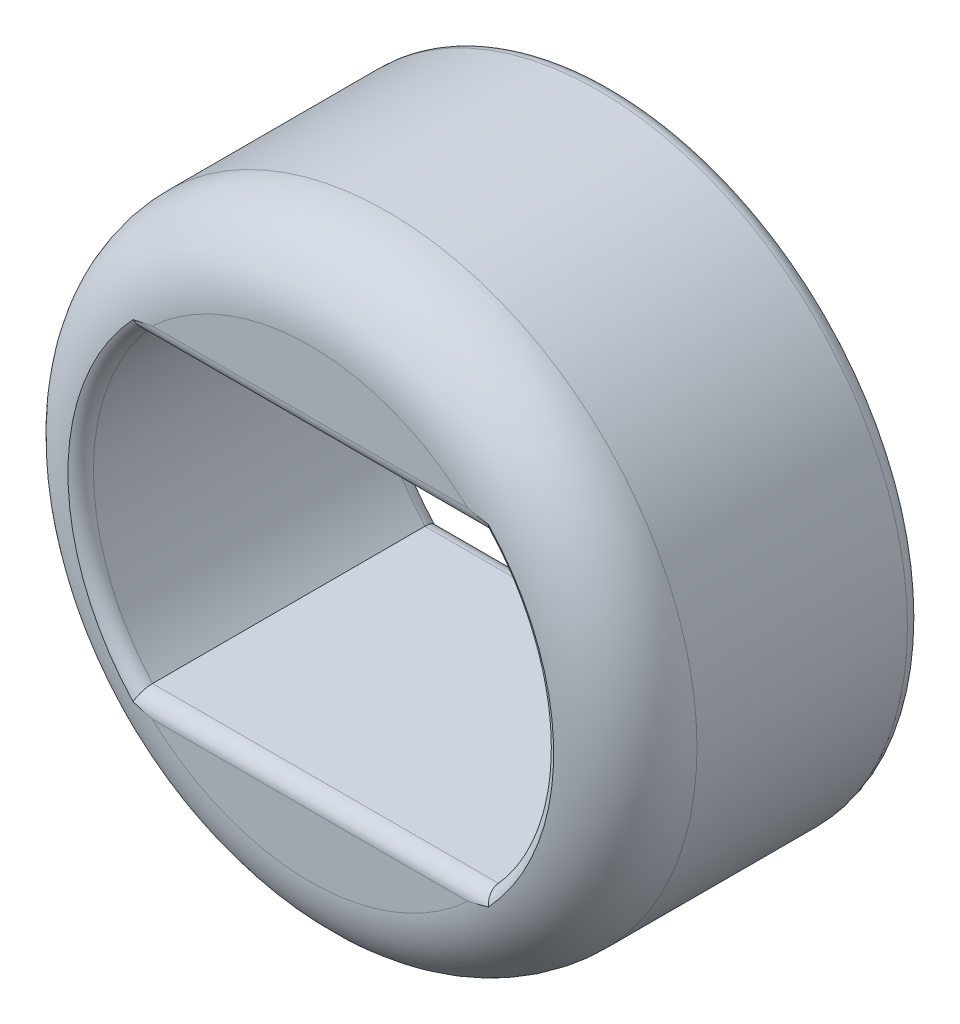
ISO-10303-21;
HEADER;
FILE_DESCRIPTION(('STEP AP214'),'2;1');
FILE_NAME('part.step','',(''),(''),'','','');
FILE_SCHEMA(('AUTOMOTIVE_DESIGN { 1 0 10303 214 1 1 1 1 }'));
ENDSEC;
DATA;
#1=APPLICATION_CONTEXT('core data for automotive mechanical design processes');
#2=APPLICATION_PROTOCOL_DEFINITION('international standard','automotive_design',2000,#1);
#3=PRODUCT_CONTEXT('',#1,'mechanical');
#4=PRODUCT('Part','Part','',(#3));
#5=PRODUCT_RELATED_PRODUCT_CATEGORY('part','',(#4));
#6=PRODUCT_DEFINITION_FORMATION('','',#4);
#7=PRODUCT_DEFINITION_CONTEXT('part definition',#1,'design');
#8=PRODUCT_DEFINITION('design','',#6,#7);
#9=PRODUCT_DEFINITION_SHAPE('','',#8);
#10=(LENGTH_UNIT() NAMED_UNIT(*) SI_UNIT(.MILLI.,.METRE.));
#11=(NAMED_UNIT(*) PLANE_ANGLE_UNIT() SI_UNIT($,.RADIAN.));
#12=(NAMED_UNIT(*) SI_UNIT($,.STERADIAN.) SOLID_ANGLE_UNIT());
#13=UNCERTAINTY_MEASURE_WITH_UNIT(LENGTH_MEASURE(1.E-05),#10,'distance_accuracy_value','');
#14=(GEOMETRIC_REPRESENTATION_CONTEXT(3) GLOBAL_UNCERTAINTY_ASSIGNED_CONTEXT((#13)) GLOBAL_UNIT_ASSIGNED_CONTEXT((#10,
#11,#12)) REPRESENTATION_CONTEXT('',''));
#15=CARTESIAN_POINT('',(0.,0.,0.));
#16=DIRECTION('',(0.,0.,1.));
#17=DIRECTION('',(1.,0.,0.));
#18=AXIS2_PLACEMENT_3D('',#15,#16,#17);
#19=CARTESIAN_POINT('',(0.,-10.,-30.));
#20=DIRECTION('',(0.,0.,-1.));
#21=DIRECTION('',(-1.,0.,0.));
#22=AXIS2_PLACEMENT_3D('',#19,#20,#21);
#23=PLANE('',#22);
#24=DIRECTION('',(1.,0.,0.));
#25=VECTOR('',#24,1.);
#26=CARTESIAN_POINT('',(5.59016994374947,5.5,-30.));
#27=LINE('',#26,#25);
#28=CARTESIAN_POINT('',(-5.09901951359279,5.5,-30.));
#29=VERTEX_POINT('',#28);
#30=CARTESIAN_POINT('',(5.09901951359279,5.5,-30.));
#31=VERTEX_POINT('',#30);
#32=EDGE_CURVE('E208',#29,#31,#27,.T.);
#33=ORIENTED_EDGE('',*,*,#32,.T.);
#34=CARTESIAN_POINT('',(0.,0.,-30.));
#35=DIRECTION('',(0.,0.,-1.));
#36=DIRECTION('',(-1.,0.,0.));
#37=AXIS2_PLACEMENT_3D('',#34,#35,#36);
#38=CIRCLE('',#37,7.5);
#39=EDGE_CURVE('E268',#31,#29,#38,.F.);
#40=ORIENTED_EDGE('',*,*,#39,.T.);
#41=EDGE_LOOP('',(#33,#40));
#42=FACE_BOUND('',#41,.T.);
#43=ADVANCED_FACE('F37',(#42),#23,.F.);
#44=CARTESIAN_POINT('',(0.,0.,-39.8));
#45=DIRECTION('',(0.,0.,1.));
#46=DIRECTION('',(1.,0.,0.));
#47=AXIS2_PLACEMENT_3D('',#44,#45,#46);
#48=CYLINDRICAL_SURFACE('',#47,10.);
#49=CARTESIAN_POINT('',(0.,0.,-32.5));
#50=DIRECTION('',(0.,0.,-1.));
#51=DIRECTION('',(-1.,0.,0.));
#52=AXIS2_PLACEMENT_3D('',#49,#50,#51);
#53=CIRCLE('',#52,10.);
#54=CARTESIAN_POINT('',(10.,0.,-32.5));
#55=VERTEX_POINT('',#54);
#56=EDGE_CURVE('E11',#55,#55,#53,.T.);
#57=CARTESIAN_POINT('',(0.,0.,-39.3));
#58=DIRECTION('',(0.,0.,1.));
#59=DIRECTION('',(1.,0.,0.));
#60=AXIS2_PLACEMENT_3D('',#57,#58,#59);
#61=CIRCLE('',#60,10.);
#62=CARTESIAN_POINT('',(10.,0.,-39.3));
#63=VERTEX_POINT('',#62);
#64=EDGE_CURVE('E308',#63,#63,#61,.T.);
#65=CARTESIAN_POINT('',(10.,0.,-32.5));
#66=CARTESIAN_POINT('',(10.,0.,-32.5708333333333));
#67=CARTESIAN_POINT('',(10.,0.,-32.6416666666667));
#68=CARTESIAN_POINT('',(10.,0.,-32.7833333333333));
#69=CARTESIAN_POINT('',(10.,0.,-32.8541666666667));
#70=CARTESIAN_POINT('',(10.,0.,-32.9958333333333));
#71=CARTESIAN_POINT('',(10.,0.,-33.0666666666667));
#72=CARTESIAN_POINT('',(10.,0.,-33.2083333333333));
#73=CARTESIAN_POINT('',(10.,0.,-33.2791666666667));
#74=CARTESIAN_POINT('',(10.,0.,-33.4208333333333));
#75=CARTESIAN_POINT('',(10.,0.,-33.4916666666667));
#76=CARTESIAN_POINT('',(10.,0.,-33.6333333333333));
#77=CARTESIAN_POINT('',(10.,0.,-33.7041666666667));
#78=CARTESIAN_POINT('',(10.,0.,-33.8458333333333));
#79=CARTESIAN_POINT('',(10.,0.,-33.9166666666667));
#80=CARTESIAN_POINT('',(10.,0.,-34.0583333333333));
#81=CARTESIAN_POINT('',(10.,0.,-34.1291666666667));
#82=CARTESIAN_POINT('',(10.,0.,-34.2708333333333));
#83=CARTESIAN_POINT('',(10.,0.,-34.3416666666667));
#84=CARTESIAN_POINT('',(10.,0.,-34.4833333333333));
#85=CARTESIAN_POINT('',(10.,0.,-34.5541666666667));
#86=CARTESIAN_POINT('',(10.,0.,-34.6958333333333));
#87=CARTESIAN_POINT('',(10.,0.,-34.7666666666667));
#88=CARTESIAN_POINT('',(10.,0.,-34.9083333333333));
#89=CARTESIAN_POINT('',(10.,0.,-34.9791666666667));
#90=CARTESIAN_POINT('',(10.,0.,-35.1208333333333));
#91=CARTESIAN_POINT('',(10.,0.,-35.1916666666667));
#92=CARTESIAN_POINT('',(10.,0.,-35.3333333333333));
#93=CARTESIAN_POINT('',(10.,0.,-35.4041666666667));
#94=CARTESIAN_POINT('',(10.,0.,-35.5458333333333));
#95=CARTESIAN_POINT('',(10.,0.,-35.6166666666667));
#96=CARTESIAN_POINT('',(10.,0.,-35.7583333333333));
#97=CARTESIAN_POINT('',(10.,0.,-35.8291666666667));
#98=CARTESIAN_POINT('',(10.,0.,-35.9708333333333));
#99=CARTESIAN_POINT('',(10.,0.,-36.0416666666667));
#100=CARTESIAN_POINT('',(10.,0.,-36.1833333333333));
#101=CARTESIAN_POINT('',(10.,0.,-36.2541666666667));
#102=CARTESIAN_POINT('',(10.,0.,-36.3958333333333));
#103=CARTESIAN_POINT('',(10.,0.,-36.4666666666667));
#104=CARTESIAN_POINT('',(10.,0.,-36.6083333333333));
#105=CARTESIAN_POINT('',(10.,0.,-36.6791666666667));
#106=CARTESIAN_POINT('',(10.,0.,-36.8208333333333));
#107=CARTESIAN_POINT('',(10.,0.,-36.8916666666667));
#108=CARTESIAN_POINT('',(10.,0.,-37.0333333333333));
#109=CARTESIAN_POINT('',(10.,0.,-37.1041666666667));
#110=CARTESIAN_POINT('',(10.,0.,-37.2458333333333));
#111=CARTESIAN_POINT('',(10.,0.,-37.3166666666667));
#112=CARTESIAN_POINT('',(10.,0.,-37.4583333333333));
#113=CARTESIAN_POINT('',(10.,0.,-37.5291666666667));
#114=CARTESIAN_POINT('',(10.,0.,-37.6708333333333));
#115=CARTESIAN_POINT('',(10.,0.,-37.7416666666667));
#116=CARTESIAN_POINT('',(10.,0.,-37.8833333333333));
#117=CARTESIAN_POINT('',(10.,0.,-37.9541666666667));
#118=CARTESIAN_POINT('',(10.,0.,-38.0958333333333));
#119=CARTESIAN_POINT('',(10.,0.,-38.1666666666667));
#120=CARTESIAN_POINT('',(10.,0.,-38.3083333333333));
#121=CARTESIAN_POINT('',(10.,0.,-38.3791666666667));
#122=CARTESIAN_POINT('',(10.,0.,-38.5208333333333));
#123=CARTESIAN_POINT('',(10.,0.,-38.5916666666667));
#124=CARTESIAN_POINT('',(10.,0.,-38.7333333333333));
#125=CARTESIAN_POINT('',(10.,0.,-38.8041666666667));
#126=CARTESIAN_POINT('',(10.,0.,-38.9458333333333));
#127=CARTESIAN_POINT('',(10.,0.,-39.0166666666667));
#128=CARTESIAN_POINT('',(10.,0.,-39.1583333333333));
#129=CARTESIAN_POINT('',(10.,0.,-39.2291666666667));
#130=CARTESIAN_POINT('',(10.,0.,-39.3));
#131=B_SPLINE_CURVE_WITH_KNOTS('',3,(#65,#66,#67,#68,#69,#70,#71,#72,#73,#74,#75,#76,#77,#78,
#79,#80,#81,#82,#83,#84,#85,#86,#87,#88,#89,#90,#91,#92,#93,#94,#95,#96,#97,#98,#99,#100,#101,
#102,#103,#104,#105,#106,#107,#108,#109,#110,#111,#112,#113,#114,#115,#116,#117,#118,#119,#120,
#121,#122,#123,#124,#125,#126,#127,#128,#129,#130),.UNSPECIFIED.,.F.,.F.,(4,2,2,2,2,2,2,2,2,2,2,
2,2,2,2,2,2,2,2,2,2,2,2,2,2,2,2,2,2,2,2,2,4),(0.,0.212500000000004,0.425000000000002,
0.637500000000006,0.850000000000004,1.06250000000001,1.27500000000001,1.48750000000001,
1.70000000000001,1.9125,2.12500000000001,2.33750000000001,2.55000000000001,2.76250000000001,
2.97500000000001,3.18750000000001,3.40000000000001,3.61250000000001,3.82500000000001,
4.03750000000001,4.25000000000001,4.46250000000002,4.67500000000001,4.88750000000002,
5.10000000000001,5.31250000000001,5.52500000000002,5.73750000000001,5.95000000000002,
6.16250000000002,6.37500000000002,6.58750000000002,6.80000000000002),.UNSPECIFIED.);
#132=EDGE_CURVE('BSEAM338',#55,#63,#131,.T.);
#133=ORIENTED_EDGE('',*,*,#56,.T.);
#134=ORIENTED_EDGE('',*,*,#64,.T.);
#135=ORIENTED_EDGE('',*,*,#132,.T.);
#136=ORIENTED_EDGE('',*,*,#132,.F.);
#137=EDGE_LOOP('',(#133,#135,#134,#136));
#138=FACE_BOUND('',#137,.T.);
#139=ADVANCED_FACE('F338',(#138),#48,.T.);
#140=CARTESIAN_POINT('',(0.,5.,-39.8));
#141=DIRECTION('',(0.,-1.,0.));
#142=DIRECTION('',(0.,0.,-1.));
#143=AXIS2_PLACEMENT_3D('',#140,#141,#142);
#144=PLANE('',#143);
#145=DIRECTION('',(0.,0.,1.));
#146=VECTOR('',#145,1.);
#147=CARTESIAN_POINT('',(5.59016994374947,5.,-39.8));
#148=LINE('',#147,#146);
#149=CARTESIAN_POINT('',(5.59016994374947,5.,-39.3));
#150=VERTEX_POINT('',#149);
#151=CARTESIAN_POINT('',(5.59016994374947,5.,-30.5));
#152=VERTEX_POINT('',#151);
#153=EDGE_CURVE('E122',#150,#152,#148,.T.);
#154=ORIENTED_EDGE('',*,*,#153,.T.);
#155=DIRECTION('',(1.,0.,0.));
#156=VECTOR('',#155,1.);
#157=CARTESIAN_POINT('',(-5.59016994374947,5.,-30.5));
#158=LINE('',#157,#156);
#159=CARTESIAN_POINT('',(-5.59016994374947,5.,-30.5));
#160=VERTEX_POINT('',#159);
#161=EDGE_CURVE('E217',#152,#160,#158,.F.);
#162=ORIENTED_EDGE('',*,*,#161,.T.);
#163=DIRECTION('',(0.,0.,1.));
#164=VECTOR('',#163,1.);
#165=CARTESIAN_POINT('',(-5.59016994374947,5.,-39.8));
#166=LINE('',#165,#164);
#167=CARTESIAN_POINT('',(-5.59016994374947,5.,-39.3));
#168=VERTEX_POINT('',#167);
#169=EDGE_CURVE('E125',#168,#160,#166,.T.);
#170=ORIENTED_EDGE('',*,*,#169,.F.);
#171=DIRECTION('',(1.,0.,0.));
#172=VECTOR('',#171,1.);
#173=CARTESIAN_POINT('',(5.59016994374947,5.,-39.3));
#174=LINE('',#173,#172);
#175=EDGE_CURVE('E119',#168,#150,#174,.T.);
#176=ORIENTED_EDGE('',*,*,#175,.T.);
#177=EDGE_LOOP('',(#154,#162,#170,#176));
#178=FACE_BOUND('',#177,.T.);
#179=ADVANCED_FACE('F121',(#178),#144,.T.);
#180=CARTESIAN_POINT('',(0.,0.,-39.8));
#181=DIRECTION('',(0.,0.,1.));
#182=DIRECTION('',(1.,0.,0.));
#183=AXIS2_PLACEMENT_3D('',#180,#181,#182);
#184=CYLINDRICAL_SURFACE('',#183,7.5);
#185=ORIENTED_EDGE('',*,*,#169,.T.);
#186=CARTESIAN_POINT('',(0.,0.,-30.5));
#187=DIRECTION('',(0.,0.,-1.));
#188=DIRECTION('',(-1.,0.,0.));
#189=AXIS2_PLACEMENT_3D('',#186,#187,#188);
#190=CIRCLE('',#189,7.5);
#191=CARTESIAN_POINT('',(-5.59016994374947,-5.,-30.5));
#192=VERTEX_POINT('',#191);
#193=EDGE_CURVE('E214',#160,#192,#190,.F.);
#194=ORIENTED_EDGE('',*,*,#193,.T.);
#195=DIRECTION('',(0.,0.,1.));
#196=VECTOR('',#195,1.);
#197=CARTESIAN_POINT('',(-5.59016994374947,-5.,-39.8));
#198=LINE('',#197,#196);
#199=CARTESIAN_POINT('',(-5.59016994374947,-5.,-39.3));
#200=VERTEX_POINT('',#199);
#201=EDGE_CURVE('E303',#200,#192,#198,.T.);
#202=ORIENTED_EDGE('',*,*,#201,.F.);
#203=CARTESIAN_POINT('',(0.,0.,-39.3));
#204=DIRECTION('',(0.,0.,1.));
#205=DIRECTION('',(1.,0.,0.));
#206=AXIS2_PLACEMENT_3D('',#203,#204,#205);
#207=CIRCLE('',#206,7.5);
#208=EDGE_CURVE('E131',#200,#168,#207,.F.);
#209=ORIENTED_EDGE('',*,*,#208,.T.);
#210=EDGE_LOOP('',(#185,#194,#202,#209));
#211=FACE_BOUND('',#210,.T.);
#212=ADVANCED_FACE('F302',(#211),#184,.F.);
#213=CARTESIAN_POINT('',(0.,-5.,-39.8));
#214=DIRECTION('',(0.,-1.,0.));
#215=DIRECTION('',(0.,0.,-1.));
#216=AXIS2_PLACEMENT_3D('',#213,#214,#215);
#217=PLANE('',#216);
#218=ORIENTED_EDGE('',*,*,#201,.T.);
#219=DIRECTION('',(1.,0.,0.));
#220=VECTOR('',#219,1.);
#221=CARTESIAN_POINT('',(0.,-5.,-30.5));
#222=LINE('',#221,#220);
#223=CARTESIAN_POINT('',(5.59016994374947,-5.,-30.5));
#224=VERTEX_POINT('',#223);
#225=EDGE_CURVE('E205',#192,#224,#222,.T.);
#226=ORIENTED_EDGE('',*,*,#225,.T.);
#227=DIRECTION('',(0.,0.,1.));
#228=VECTOR('',#227,1.);
#229=CARTESIAN_POINT('',(5.59016994374947,-5.,-39.8));
#230=LINE('',#229,#228);
#231=CARTESIAN_POINT('',(5.59016994374947,-5.,-39.3));
#232=VERTEX_POINT('',#231);
#233=EDGE_CURVE('E143',#232,#224,#230,.T.);
#234=ORIENTED_EDGE('',*,*,#233,.F.);
#235=DIRECTION('',(1.,0.,0.));
#236=VECTOR('',#235,1.);
#237=CARTESIAN_POINT('',(0.,-5.,-39.3));
#238=LINE('',#237,#236);
#239=EDGE_CURVE('E130',#232,#200,#238,.F.);
#240=ORIENTED_EDGE('',*,*,#239,.T.);
#241=EDGE_LOOP('',(#218,#226,#234,#240));
#242=FACE_BOUND('',#241,.T.);
#243=ADVANCED_FACE('F306',(#242),#217,.F.);
#244=CARTESIAN_POINT('',(0.,0.,-39.8));
#245=DIRECTION('',(0.,0.,1.));
#246=DIRECTION('',(1.,0.,0.));
#247=AXIS2_PLACEMENT_3D('',#244,#245,#246);
#248=CYLINDRICAL_SURFACE('',#247,7.5);
#249=ORIENTED_EDGE('',*,*,#233,.T.);
#250=CARTESIAN_POINT('',(0.,0.,-30.5));
#251=DIRECTION('',(0.,0.,-1.));
#252=DIRECTION('',(-1.,0.,0.));
#253=AXIS2_PLACEMENT_3D('',#250,#251,#252);
#254=CIRCLE('',#253,7.5);
#255=EDGE_CURVE('E142',#224,#152,#254,.F.);
#256=ORIENTED_EDGE('',*,*,#255,.T.);
#257=ORIENTED_EDGE('',*,*,#153,.F.);
#258=CARTESIAN_POINT('',(0.,0.,-39.3));
#259=DIRECTION('',(0.,0.,1.));
#260=DIRECTION('',(1.,0.,0.));
#261=AXIS2_PLACEMENT_3D('',#258,#259,#260);
#262=CIRCLE('',#261,7.5);
#263=EDGE_CURVE('E139',#150,#232,#262,.F.);
#264=ORIENTED_EDGE('',*,*,#263,.T.);
#265=EDGE_LOOP('',(#249,#256,#257,#264));
#266=FACE_BOUND('',#265,.T.);
#267=ADVANCED_FACE('F138',(#266),#248,.F.);
#268=CARTESIAN_POINT('',(0.,0.,-39.8));
#269=DIRECTION('',(0.,0.,1.));
#270=DIRECTION('',(1.,0.,0.));
#271=AXIS2_PLACEMENT_3D('',#268,#269,#270);
#272=PLANE('',#271);
#273=CARTESIAN_POINT('',(0.,0.,-39.8));
#274=DIRECTION('',(0.,0.,1.));
#275=DIRECTION('',(1.,0.,0.));
#276=AXIS2_PLACEMENT_3D('',#273,#274,#275);
#277=CIRCLE('',#276,8.);
#278=CARTESIAN_POINT('',(5.80947501931114,-5.5,-39.8));
#279=VERTEX_POINT('',#278);
#280=CARTESIAN_POINT('',(5.80947501931114,5.49999999999999,-39.8));
#281=VERTEX_POINT('',#280);
#282=EDGE_CURVE('E319',#279,#281,#277,.T.);
#283=ORIENTED_EDGE('',*,*,#282,.T.);
#284=DIRECTION('',(1.,0.,0.));
#285=VECTOR('',#284,1.);
#286=CARTESIAN_POINT('',(-5.59016994374947,5.5,-39.8));
#287=LINE('',#286,#285);
#288=CARTESIAN_POINT('',(-5.80947501931114,5.49999999999999,-39.8));
#289=VERTEX_POINT('',#288);
#290=EDGE_CURVE('E158',#281,#289,#287,.F.);
#291=ORIENTED_EDGE('',*,*,#290,.T.);
#292=CARTESIAN_POINT('',(0.,0.,-39.8));
#293=DIRECTION('',(0.,0.,1.));
#294=DIRECTION('',(1.,0.,0.));
#295=AXIS2_PLACEMENT_3D('',#292,#293,#294);
#296=CIRCLE('',#295,8.);
#297=CARTESIAN_POINT('',(-5.80947501931114,-5.5,-39.8));
#298=VERTEX_POINT('',#297);
#299=EDGE_CURVE('E317',#289,#298,#296,.T.);
#300=ORIENTED_EDGE('',*,*,#299,.T.);
#301=DIRECTION('',(1.,0.,0.));
#302=VECTOR('',#301,1.);
#303=CARTESIAN_POINT('',(0.,-5.5,-39.8));
#304=LINE('',#303,#302);
#305=EDGE_CURVE('E154',#298,#279,#304,.T.);
#306=ORIENTED_EDGE('',*,*,#305,.T.);
#307=EDGE_LOOP('',(#283,#291,#300,#306));
#308=FACE_BOUND('',#307,.T.);
#309=CARTESIAN_POINT('',(0.,0.,-39.8));
#310=DIRECTION('',(0.,0.,1.));
#311=DIRECTION('',(1.,0.,0.));
#312=AXIS2_PLACEMENT_3D('',#309,#310,#311);
#313=CIRCLE('',#312,9.5);
#314=CARTESIAN_POINT('',(9.5,0.,-39.8));
#315=VERTEX_POINT('',#314);
#316=EDGE_CURVE('E155',#315,#315,#313,.F.);
#317=ORIENTED_EDGE('',*,*,#316,.T.);
#318=EDGE_LOOP('',(#317));
#319=FACE_BOUND('',#318,.T.);
#320=ADVANCED_FACE('F327',(#308,#319),#272,.F.);
#321=CARTESIAN_POINT('',(0.,0.,-39.3));
#322=DIRECTION('',(0.,0.,1.));
#323=DIRECTION('',(1.,0.,0.));
#324=AXIS2_PLACEMENT_3D('',#321,#322,#323);
#325=TOROIDAL_SURFACE('',#324,9.5,0.5);
#326=ORIENTED_EDGE('',*,*,#316,.F.);
#327=EDGE_LOOP('',(#326));
#328=FACE_BOUND('',#327,.T.);
#329=ORIENTED_EDGE('',*,*,#64,.F.);
#330=EDGE_LOOP('',(#329));
#331=FACE_BOUND('',#330,.T.);
#332=ADVANCED_FACE('F330',(#328,#331),#325,.T.);
#333=CARTESIAN_POINT('',(0.,0.,-39.3));
#334=DIRECTION('',(0.,0.,1.));
#335=DIRECTION('',(1.,0.,0.));
#336=AXIS2_PLACEMENT_3D('',#333,#334,#335);
#337=TOROIDAL_SURFACE('',#336,8.,0.5);
#338=CARTESIAN_POINT('',(-5.59016994374947,5.,-39.3));
#339=CARTESIAN_POINT('',(-5.59015538183691,4.99996942406594,-39.3263897108267));
#340=CARTESIAN_POINT('',(-5.59110332091747,5.00208709781666,-39.3527576051876));
#341=CARTESIAN_POINT('',(-5.59480921351498,5.01037682456998,-39.4046353917744));
#342=CARTESIAN_POINT('',(-5.59756146326676,5.01653610136215,-39.4301477223332));
#343=CARTESIAN_POINT('',(-5.60476080929634,5.03266632840295,-39.4796650896369));
#344=CARTESIAN_POINT('',(-5.60920720982345,5.04263571392836,-39.5036707404348));
#345=CARTESIAN_POINT('',(-5.61960826710032,5.06599398719577,-39.5496051030726));
#346=CARTESIAN_POINT('',(-5.62556365180265,5.07938452537,-39.5715328054496));
#347=CARTESIAN_POINT('',(-5.63900460961214,5.10966528197748,-39.6135831210661));
#348=CARTESIAN_POINT('',(-5.64653774685677,5.12666458491504,-39.6336117307777));
#349=CARTESIAN_POINT('',(-5.66273476631988,5.16329989281001,-39.6705541285434));
#350=CARTESIAN_POINT('',(-5.67139901819591,5.18293675980585,-39.687466893938));
#351=CARTESIAN_POINT('',(-5.69035646586347,5.22601195431861,-39.7191698591247));
#352=CARTESIAN_POINT('',(-5.70072506008761,5.24963019719289,-39.7336702857162));
#353=CARTESIAN_POINT('',(-5.72218971499254,5.29866799869196,-39.7584986894823));
#354=CARTESIAN_POINT('',(-5.73328607865677,5.32408830791,-39.768824915882));
#355=CARTESIAN_POINT('',(-5.75485076697757,5.37364040279722,-39.7844003735712));
#356=CARTESIAN_POINT('',(-5.76528052866732,5.39766977040558,-39.7900346313669));
#357=CARTESIAN_POINT('',(-5.78628403400375,5.4461946140273,-39.7977009989576));
#358=CARTESIAN_POINT('',(-5.79685744274802,5.47068904590998,-39.79974039096));
#359=CARTESIAN_POINT('',(-5.80809199104949,5.49678641738238,-39.7999922715112));
#360=CARTESIAN_POINT('',(-5.80878358696316,5.49839325391114,-39.8000000184608));
#361=CARTESIAN_POINT('',(-5.80947501931113,5.5,-39.8));
#362=B_SPLINE_CURVE_WITH_KNOTS('',3,(#338,#339,#340,#341,#342,#343,#344,#345,#346,#347,#348,
#349,#350,#351,#352,#353,#354,#355,#356,#357,#358,#359,#360,#361),.UNSPECIFIED.,.F.,.F.,(4,2,2,
2,2,2,2,2,2,2,2,4),(0.,0.0790333558003209,0.157818069282368,0.236570462418626,0.315360919253046,
0.397001833785441,0.478669496345503,0.567067242570791,0.655502026875738,0.735651228157404,
0.815637881849034,0.820885905761612),.UNSPECIFIED.);
#363=EDGE_CURVE('E162',#168,#289,#362,.T.);
#364=ORIENTED_EDGE('',*,*,#363,.F.);
#365=ORIENTED_EDGE('',*,*,#208,.F.);
#366=CARTESIAN_POINT('',(-5.59016994374947,-5.,-39.3));
#367=CARTESIAN_POINT('',(-5.59015538183691,-4.99996942406594,-39.3263897108267));
#368=CARTESIAN_POINT('',(-5.59110332091747,-5.00208709781666,-39.3527576051876));
#369=CARTESIAN_POINT('',(-5.59480921351498,-5.01037682456998,-39.4046353917744));
#370=CARTESIAN_POINT('',(-5.59756146326676,-5.01653610136215,-39.4301477223332));
#371=CARTESIAN_POINT('',(-5.60476080929634,-5.03266632840295,-39.4796650896369));
#372=CARTESIAN_POINT('',(-5.60920720982345,-5.04263571392836,-39.5036707404348));
#373=CARTESIAN_POINT('',(-5.61960826710032,-5.06599398719577,-39.5496051030726));
#374=CARTESIAN_POINT('',(-5.62556365180265,-5.07938452537,-39.5715328054496));
#375=CARTESIAN_POINT('',(-5.63900460961214,-5.10966528197748,-39.6135831210661));
#376=CARTESIAN_POINT('',(-5.64653774685677,-5.12666458491504,-39.6336117307777));
#377=CARTESIAN_POINT('',(-5.66273476631988,-5.16329989281001,-39.6705541285434));
#378=CARTESIAN_POINT('',(-5.67139901819591,-5.18293675980585,-39.687466893938));
#379=CARTESIAN_POINT('',(-5.69035646586347,-5.22601195431861,-39.7191698591247));
#380=CARTESIAN_POINT('',(-5.70072506008761,-5.24963019719289,-39.7336702857162));
#381=CARTESIAN_POINT('',(-5.72218971499254,-5.29866799869196,-39.7584986894823));
#382=CARTESIAN_POINT('',(-5.73328607865677,-5.32408830791,-39.768824915882));
#383=CARTESIAN_POINT('',(-5.75485076697757,-5.37364040279722,-39.7844003735712));
#384=CARTESIAN_POINT('',(-5.76528052866732,-5.39766977040558,-39.7900346313669));
#385=CARTESIAN_POINT('',(-5.78628403400375,-5.4461946140273,-39.7977009989576));
#386=CARTESIAN_POINT('',(-5.79685744274802,-5.47068904590998,-39.79974039096));
#387=CARTESIAN_POINT('',(-5.80809199104949,-5.49678641738238,-39.7999922715112));
#388=CARTESIAN_POINT('',(-5.80878358696316,-5.49839325391114,-39.8000000184608));
#389=CARTESIAN_POINT('',(-5.80947501931113,-5.5,-39.8));
#390=B_SPLINE_CURVE_WITH_KNOTS('',3,(#366,#367,#368,#369,#370,#371,#372,#373,#374,#375,#376,
#377,#378,#379,#380,#381,#382,#383,#384,#385,#386,#387,#388,#389),.UNSPECIFIED.,.F.,.F.,(4,2,2,
2,2,2,2,2,2,2,2,4),(0.,0.0790333558003209,0.157818069282368,0.236570462418626,0.315360919253046,
0.397001833785441,0.478669496345503,0.567067242570791,0.655502026875738,0.735651228157404,
0.815637881849034,0.820885905761612),.UNSPECIFIED.);
#391=EDGE_CURVE('E144',#298,#200,#390,.F.);
#392=ORIENTED_EDGE('',*,*,#391,.F.);
#393=ORIENTED_EDGE('',*,*,#299,.F.);
#394=EDGE_LOOP('',(#364,#365,#392,#393));
#395=FACE_BOUND('',#394,.T.);
#396=ADVANCED_FACE('F189',(#395),#337,.T.);
#397=CARTESIAN_POINT('',(0.,-5.5,-39.3));
#398=DIRECTION('',(1.,0.,0.));
#399=DIRECTION('',(0.,0.,-1.));
#400=AXIS2_PLACEMENT_3D('',#397,#398,#399);
#401=CYLINDRICAL_SURFACE('',#400,0.5);
#402=ORIENTED_EDGE('',*,*,#391,.T.);
#403=ORIENTED_EDGE('',*,*,#239,.F.);
#404=CARTESIAN_POINT('',(5.59016994374947,-5.,-39.3));
#405=CARTESIAN_POINT('',(5.59015538183691,-4.99996942406594,-39.3263897108267));
#406=CARTESIAN_POINT('',(5.59110332091747,-5.00208709781666,-39.3527576051876));
#407=CARTESIAN_POINT('',(5.59480921351498,-5.01037682456998,-39.4046353917744));
#408=CARTESIAN_POINT('',(5.59756146326676,-5.01653610136215,-39.4301477223332));
#409=CARTESIAN_POINT('',(5.60476080929634,-5.03266632840295,-39.4796650896369));
#410=CARTESIAN_POINT('',(5.60920720982345,-5.04263571392836,-39.5036707404348));
#411=CARTESIAN_POINT('',(5.61960826710032,-5.06599398719577,-39.5496051030726));
#412=CARTESIAN_POINT('',(5.62556365180265,-5.07938452537,-39.5715328054496));
#413=CARTESIAN_POINT('',(5.63900460961214,-5.10966528197748,-39.6135831210661));
#414=CARTESIAN_POINT('',(5.64653774685677,-5.12666458491504,-39.6336117307777));
#415=CARTESIAN_POINT('',(5.66273476631988,-5.16329989281001,-39.6705541285434));
#416=CARTESIAN_POINT('',(5.67139901819591,-5.18293675980585,-39.687466893938));
#417=CARTESIAN_POINT('',(5.69035646586347,-5.22601195431861,-39.7191698591247));
#418=CARTESIAN_POINT('',(5.70072506008761,-5.24963019719289,-39.7336702857162));
#419=CARTESIAN_POINT('',(5.72218971499254,-5.29866799869196,-39.7584986894823));
#420=CARTESIAN_POINT('',(5.73328607865677,-5.32408830791,-39.768824915882));
#421=CARTESIAN_POINT('',(5.75485076697757,-5.37364040279722,-39.7844003735712));
#422=CARTESIAN_POINT('',(5.76528052866732,-5.39766977040558,-39.7900346313669));
#423=CARTESIAN_POINT('',(5.78628403400375,-5.4461946140273,-39.7977009989576));
#424=CARTESIAN_POINT('',(5.79685744274802,-5.47068904590998,-39.79974039096));
#425=CARTESIAN_POINT('',(5.80809199104949,-5.49678641738238,-39.7999922715112));
#426=CARTESIAN_POINT('',(5.80878358696316,-5.49839325391114,-39.8000000184608));
#427=CARTESIAN_POINT('',(5.80947501931113,-5.5,-39.8));
#428=B_SPLINE_CURVE_WITH_KNOTS('',3,(#404,#405,#406,#407,#408,#409,#410,#411,#412,#413,#414,
#415,#416,#417,#418,#419,#420,#421,#422,#423,#424,#425,#426,#427),.UNSPECIFIED.,.F.,.F.,(4,2,2,
2,2,2,2,2,2,2,2,4),(0.,0.0790333558003209,0.157818069282368,0.236570462418626,0.315360919253046,
0.397001833785441,0.478669496345503,0.567067242570791,0.655502026875738,0.735651228157404,
0.815637881849034,0.820885905761612),.UNSPECIFIED.);
#429=EDGE_CURVE('E152',#279,#232,#428,.F.);
#430=ORIENTED_EDGE('',*,*,#429,.F.);
#431=ORIENTED_EDGE('',*,*,#305,.F.);
#432=EDGE_LOOP('',(#402,#403,#430,#431));
#433=FACE_BOUND('',#432,.T.);
#434=ADVANCED_FACE('F184',(#433),#401,.T.);
#435=CARTESIAN_POINT('',(0.,5.5,-39.3));
#436=DIRECTION('',(-1.,0.,0.));
#437=DIRECTION('',(0.,0.,1.));
#438=AXIS2_PLACEMENT_3D('',#435,#436,#437);
#439=CYLINDRICAL_SURFACE('',#438,0.5);
#440=ORIENTED_EDGE('',*,*,#363,.T.);
#441=ORIENTED_EDGE('',*,*,#290,.F.);
#442=CARTESIAN_POINT('',(5.59016994374947,5.,-39.3));
#443=CARTESIAN_POINT('',(5.59015538183691,4.99996942406594,-39.3263897108267));
#444=CARTESIAN_POINT('',(5.59110332091747,5.00208709781666,-39.3527576051876));
#445=CARTESIAN_POINT('',(5.59480921351498,5.01037682456998,-39.4046353917744));
#446=CARTESIAN_POINT('',(5.59756146326676,5.01653610136215,-39.4301477223332));
#447=CARTESIAN_POINT('',(5.60476080929634,5.03266632840295,-39.4796650896369));
#448=CARTESIAN_POINT('',(5.60920720982345,5.04263571392836,-39.5036707404348));
#449=CARTESIAN_POINT('',(5.61960826710032,5.06599398719577,-39.5496051030726));
#450=CARTESIAN_POINT('',(5.62556365180265,5.07938452537,-39.5715328054496));
#451=CARTESIAN_POINT('',(5.63900460961214,5.10966528197748,-39.6135831210661));
#452=CARTESIAN_POINT('',(5.64653774685677,5.12666458491504,-39.6336117307777));
#453=CARTESIAN_POINT('',(5.66273476631988,5.16329989281001,-39.6705541285434));
#454=CARTESIAN_POINT('',(5.67139901819591,5.18293675980585,-39.687466893938));
#455=CARTESIAN_POINT('',(5.69035646586347,5.22601195431861,-39.7191698591247));
#456=CARTESIAN_POINT('',(5.70072506008761,5.24963019719289,-39.7336702857162));
#457=CARTESIAN_POINT('',(5.72218971499254,5.29866799869196,-39.7584986894823));
#458=CARTESIAN_POINT('',(5.73328607865677,5.32408830791,-39.768824915882));
#459=CARTESIAN_POINT('',(5.75485076697757,5.37364040279722,-39.7844003735712));
#460=CARTESIAN_POINT('',(5.76528052866732,5.39766977040558,-39.7900346313669));
#461=CARTESIAN_POINT('',(5.78628403400375,5.4461946140273,-39.7977009989576));
#462=CARTESIAN_POINT('',(5.79685744274802,5.47068904590998,-39.79974039096));
#463=CARTESIAN_POINT('',(5.80809199104949,5.49678641738238,-39.7999922715112));
#464=CARTESIAN_POINT('',(5.80878358696316,5.49839325391114,-39.8000000184608));
#465=CARTESIAN_POINT('',(5.80947501931113,5.5,-39.8));
#466=B_SPLINE_CURVE_WITH_KNOTS('',3,(#442,#443,#444,#445,#446,#447,#448,#449,#450,#451,#452,
#453,#454,#455,#456,#457,#458,#459,#460,#461,#462,#463,#464,#465),.UNSPECIFIED.,.F.,.F.,(4,2,2,
2,2,2,2,2,2,2,2,4),(0.,0.0790333558003209,0.157818069282368,0.236570462418626,0.315360919253046,
0.397001833785441,0.478669496345503,0.567067242570791,0.655502026875738,0.735651228157404,
0.815637881849034,0.820885905761612),.UNSPECIFIED.);
#467=EDGE_CURVE('E149',#150,#281,#466,.T.);
#468=ORIENTED_EDGE('',*,*,#467,.F.);
#469=ORIENTED_EDGE('',*,*,#175,.F.);
#470=EDGE_LOOP('',(#440,#441,#468,#469));
#471=FACE_BOUND('',#470,.T.);
#472=ADVANCED_FACE('F157',(#471),#439,.T.);
#473=CARTESIAN_POINT('',(0.,0.,-39.3));
#474=DIRECTION('',(0.,0.,1.));
#475=DIRECTION('',(1.,0.,0.));
#476=AXIS2_PLACEMENT_3D('',#473,#474,#475);
#477=TOROIDAL_SURFACE('',#476,8.,0.5);
#478=ORIENTED_EDGE('',*,*,#429,.T.);
#479=ORIENTED_EDGE('',*,*,#263,.F.);
#480=ORIENTED_EDGE('',*,*,#467,.T.);
#481=ORIENTED_EDGE('',*,*,#282,.F.);
#482=EDGE_LOOP('',(#478,#479,#480,#481));
#483=FACE_BOUND('',#482,.T.);
#484=ADVANCED_FACE('F147',(#483),#477,.T.);
#485=DIRECTION('',(1.,0.,0.));
#486=VECTOR('',#485,1.);
#487=CARTESIAN_POINT('',(0.,-5.5,-30.));
#488=LINE('',#487,#486);
#489=CARTESIAN_POINT('',(5.09901951359279,-5.5,-30.));
#490=VERTEX_POINT('',#489);
#491=CARTESIAN_POINT('',(-5.09901951359279,-5.5,-30.));
#492=VERTEX_POINT('',#491);
#493=EDGE_CURVE('E211',#490,#492,#488,.F.);
#494=ORIENTED_EDGE('',*,*,#493,.T.);
#495=CARTESIAN_POINT('',(0.,0.,-30.));
#496=DIRECTION('',(0.,0.,-1.));
#497=DIRECTION('',(-1.,0.,0.));
#498=AXIS2_PLACEMENT_3D('',#495,#496,#497);
#499=CIRCLE('',#498,7.5);
#500=EDGE_CURVE('E219',#492,#490,#499,.F.);
#501=ORIENTED_EDGE('',*,*,#500,.T.);
#502=EDGE_LOOP('',(#494,#501));
#503=FACE_BOUND('',#502,.T.);
#504=ADVANCED_FACE('F183',(#503),#23,.F.);
#505=CARTESIAN_POINT('',(0.,5.5,-30.5));
#506=DIRECTION('',(-1.,0.,0.));
#507=DIRECTION('',(0.,0.,1.));
#508=AXIS2_PLACEMENT_3D('',#505,#506,#507);
#509=CYLINDRICAL_SURFACE('',#508,0.5);
#510=ORIENTED_EDGE('',*,*,#32,.F.);
#511=CARTESIAN_POINT('',(-5.74305465594941,5.34653535624445,-30.0241338390713));
#512=CARTESIAN_POINT('',(-5.5471900085012,5.3946143853889,-30.0087111444829));
#513=CARTESIAN_POINT('',(-5.3507210185107,5.44194368805414,-30.0013042562742));
#514=CARTESIAN_POINT('',(-5.14007444477635,5.49057371796121,-30.0000788094623));
#515=CARTESIAN_POINT('',(-5.1263578998158,5.49373076494239,-30.0000293908157));
#516=CARTESIAN_POINT('',(-5.1080995152332,5.49791996219577,-30.0000032434486));
#517=CARTESIAN_POINT('',(-5.10355963395334,5.49896050384561,-30.0000000024218));
#518=CARTESIAN_POINT('',(-5.09901951359279,5.5,-30.));
#519=B_SPLINE_CURVE_WITH_KNOTS('',3,(#511,#512,#513,#514,#515,#516,#517,#518),.UNSPECIFIED.,.F.,
.F.,(4,2,2,4),(0.,0.606344889169328,0.648570545586259,0.662543347858628),.UNSPECIFIED.);
#520=CARTESIAN_POINT('',(-5.74305465594941,5.34653535624445,-30.0241338390713));
#521=VERTEX_POINT('',#520);
#522=EDGE_CURVE('E267',#29,#521,#519,.F.);
#523=ORIENTED_EDGE('',*,*,#522,.T.);
#524=CARTESIAN_POINT('',(-5.60116187479122,5.02460286952293,-30.6549114854818));
#525=CARTESIAN_POINT('',(-5.59753781672832,5.01648531340091,-30.6301055415748));
#526=CARTESIAN_POINT('',(-5.59478913378879,5.01033296035116,-30.6045277972435));
#527=CARTESIAN_POINT('',(-5.5911068964787,5.00209403663035,-30.5526332280391));
#528=CARTESIAN_POINT('',(-5.59017098299512,5.00000218167572,-30.52631740902));
#529=CARTESIAN_POINT('',(-5.59016890368398,4.99999781660318,-30.4736618294659));
#530=CARTESIAN_POINT('',(-5.59110421346219,5.00208860482624,-30.447322066421));
#531=CARTESIAN_POINT('',(-5.59479766384226,5.01035147538764,-30.3954347933841));
#532=CARTESIAN_POINT('',(-5.59755530554585,5.01652244069963,-30.3698870685599));
#533=CARTESIAN_POINT('',(-5.60476192647226,5.03266869590522,-30.3203347748583));
#534=CARTESIAN_POINT('',(-5.60920784021089,5.04263709071072,-30.2963275007192));
#535=CARTESIAN_POINT('',(-5.61960850246113,5.065994555043,-30.2503928313038));
#536=CARTESIAN_POINT('',(-5.62556385426929,5.07938499231934,-30.2284662724813));
#537=CARTESIAN_POINT('',(-5.63900522985152,5.10966666808673,-30.186415237629));
#538=CARTESIAN_POINT('',(-5.64653897349739,5.12666734993533,-30.1663850813147));
#539=CARTESIAN_POINT('',(-5.66273613457388,5.16330299706531,-30.1294431413265));
#540=CARTESIAN_POINT('',(-5.67139974143257,5.18293840408953,-30.1125318817041));
#541=CARTESIAN_POINT('',(-5.69035604384224,5.22601099438026,-30.0808308627302));
#542=CARTESIAN_POINT('',(-5.70072416209783,5.24962815132271,-30.0663309731587));
#543=CARTESIAN_POINT('',(-5.7221887516537,5.29866579220013,-30.0415022045734));
#544=CARTESIAN_POINT('',(-5.73328558848204,5.32408718166949,-30.0311754376811));
#545=CARTESIAN_POINT('',(-5.75485089069412,5.3736406869867,-30.0155995375018));
#546=CARTESIAN_POINT('',(-5.76528077898329,5.39767034710741,-30.0099652335991));
#547=CARTESIAN_POINT('',(-5.78628428761167,5.44619520154541,-30.0022989519941));
#548=CARTESIAN_POINT('',(-5.79685756910359,5.47068933942907,-30.0002596061973));
#549=CARTESIAN_POINT('',(-5.80809199104878,5.49678641738072,-30.0000077284894));
#550=CARTESIAN_POINT('',(-5.80878358696245,5.49839325390947,-29.9999999815399));
#551=CARTESIAN_POINT('',(-5.80947501931113,5.5,-30.));
#552=B_SPLINE_CURVE_WITH_KNOTS('',3,(#524,#525,#526,#527,#528,#529,#530,#531,#532,#533,#534,
#535,#536,#537,#538,#539,#540,#541,#542,#543,#544,#545,#546,#547,#548,#549,#550,#551),
.UNSPECIFIED.,.F.,.F.,(4,2,2,2,2,2,2,2,2,2,2,2,2,4),(0.,0.0789604553410921,0.157818083416006,
0.236737921405031,0.315636162523088,0.394391823719085,0.4731790119788,0.554826446833666,
0.636487587991101,0.724881512241053,0.813320118997886,0.893470278803707,0.973455973937579,
0.978703997850161),.UNSPECIFIED.);
#553=EDGE_CURVE('E160',#160,#521,#552,.T.);
#554=ORIENTED_EDGE('',*,*,#553,.F.);
#555=ORIENTED_EDGE('',*,*,#161,.F.);
#556=CARTESIAN_POINT('',(5.60116187479122,5.02460286952293,-30.6549114854818));
#557=CARTESIAN_POINT('',(5.59753781672832,5.01648531340091,-30.6301055415748));
#558=CARTESIAN_POINT('',(5.59478913378879,5.01033296035116,-30.6045277972435));
#559=CARTESIAN_POINT('',(5.5911068964787,5.00209403663035,-30.5526332280391));
#560=CARTESIAN_POINT('',(5.59017098299512,5.00000218167572,-30.52631740902));
#561=CARTESIAN_POINT('',(5.59016890368398,4.99999781660318,-30.4736618294659));
#562=CARTESIAN_POINT('',(5.59110421346219,5.00208860482624,-30.447322066421));
#563=CARTESIAN_POINT('',(5.59479766384226,5.01035147538764,-30.3954347933841));
#564=CARTESIAN_POINT('',(5.59755530554585,5.01652244069963,-30.3698870685599));
#565=CARTESIAN_POINT('',(5.60476192647226,5.03266869590522,-30.3203347748583));
#566=CARTESIAN_POINT('',(5.60920784021089,5.04263709071072,-30.2963275007192));
#567=CARTESIAN_POINT('',(5.61960850246113,5.065994555043,-30.2503928313038));
#568=CARTESIAN_POINT('',(5.62556385426929,5.07938499231934,-30.2284662724813));
#569=CARTESIAN_POINT('',(5.63900522985152,5.10966666808673,-30.186415237629));
#570=CARTESIAN_POINT('',(5.64653897349739,5.12666734993533,-30.1663850813147));
#571=CARTESIAN_POINT('',(5.66273613457388,5.16330299706531,-30.1294431413265));
#572=CARTESIAN_POINT('',(5.67139974143257,5.18293840408953,-30.1125318817041));
#573=CARTESIAN_POINT('',(5.69035604384224,5.22601099438026,-30.0808308627302));
#574=CARTESIAN_POINT('',(5.70072416209783,5.24962815132271,-30.0663309731587));
#575=CARTESIAN_POINT('',(5.7221887516537,5.29866579220013,-30.0415022045734));
#576=CARTESIAN_POINT('',(5.73328558848204,5.32408718166949,-30.0311754376811));
#577=CARTESIAN_POINT('',(5.75485089069412,5.3736406869867,-30.0155995375018));
#578=CARTESIAN_POINT('',(5.76528077898329,5.39767034710741,-30.0099652335991));
#579=CARTESIAN_POINT('',(5.78628428761167,5.44619520154541,-30.0022989519941));
#580=CARTESIAN_POINT('',(5.79685756910359,5.47068933942907,-30.0002596061973));
#581=CARTESIAN_POINT('',(5.80809199104878,5.49678641738072,-30.0000077284894));
#582=CARTESIAN_POINT('',(5.80878358696245,5.49839325390947,-29.9999999815399));
#583=CARTESIAN_POINT('',(5.80947501931113,5.5,-30.));
#584=B_SPLINE_CURVE_WITH_KNOTS('',3,(#556,#557,#558,#559,#560,#561,#562,#563,#564,#565,#566,
#567,#568,#569,#570,#571,#572,#573,#574,#575,#576,#577,#578,#579,#580,#581,#582,#583),
.UNSPECIFIED.,.F.,.F.,(4,2,2,2,2,2,2,2,2,2,2,2,2,4),(0.,0.0789604553410921,0.157818083416006,
0.236737921405031,0.315636162523088,0.394391823719085,0.4731790119788,0.554826446833666,
0.636487587991101,0.724881512241053,0.813320118997886,0.893470278803707,0.973455973937579,
0.978703997850161),.UNSPECIFIED.);
#585=CARTESIAN_POINT('',(5.74305465594862,5.34653535624263,-30.0241338390719));
#586=VERTEX_POINT('',#585);
#587=EDGE_CURVE('E164',#586,#152,#584,.F.);
#588=ORIENTED_EDGE('',*,*,#587,.F.);
#589=CARTESIAN_POINT('',(5.74305465594862,5.34653535624263,-30.0241338390719));
#590=CARTESIAN_POINT('',(5.54719000850105,5.39461438538902,-30.0087111444829));
#591=CARTESIAN_POINT('',(5.35072101851069,5.44194368805416,-30.0013042562742));
#592=CARTESIAN_POINT('',(5.14007444477644,5.49057371796119,-30.0000788094623));
#593=CARTESIAN_POINT('',(5.12635789981585,5.49373076494238,-30.0000293908157));
#594=CARTESIAN_POINT('',(5.1080995152332,5.49791996219576,-30.0000032434486));
#595=CARTESIAN_POINT('',(5.10355963395334,5.49896050384561,-30.0000000024218));
#596=CARTESIAN_POINT('',(5.09901951359279,5.5,-30.));
#597=B_SPLINE_CURVE_WITH_KNOTS('',3,(#589,#590,#591,#592,#593,#594,#595,#596),.UNSPECIFIED.,.F.,
.F.,(4,2,2,4),(0.,0.606344889168862,0.648570545585935,0.662543347858304),.UNSPECIFIED.);
#598=EDGE_CURVE('E261',#586,#31,#597,.T.);
#599=ORIENTED_EDGE('',*,*,#598,.T.);
#600=EDGE_LOOP('',(#510,#523,#554,#555,#588,#599));
#601=FACE_BOUND('',#600,.T.);
#602=ADVANCED_FACE('F252',(#601),#509,.T.);
#603=CARTESIAN_POINT('',(0.,0.,-30.5));
#604=DIRECTION('',(0.,0.,-1.));
#605=DIRECTION('',(-1.,0.,0.));
#606=AXIS2_PLACEMENT_3D('',#603,#604,#605);
#607=TOROIDAL_SURFACE('',#606,8.,0.5);
#608=ORIENTED_EDGE('',*,*,#553,.T.);
#609=CARTESIAN_POINT('',(0.,0.,-30.0241338390713));
#610=DIRECTION('',(0.,0.,-1.));
#611=DIRECTION('',(-1.,0.,0.));
#612=AXIS2_PLACEMENT_3D('',#609,#610,#611);
#613=CIRCLE('',#612,7.84653535624445);
#614=CARTESIAN_POINT('',(-5.74305465594941,-5.34653535624445,-30.0241338390713));
#615=VERTEX_POINT('',#614);
#616=EDGE_CURVE('E61',#521,#615,#613,.F.);
#617=ORIENTED_EDGE('',*,*,#616,.T.);
#618=CARTESIAN_POINT('',(-5.60116187479122,-5.02460286952293,-30.6549114854818));
#619=CARTESIAN_POINT('',(-5.59753781672832,-5.01648531340091,-30.6301055415748));
#620=CARTESIAN_POINT('',(-5.59478913378879,-5.01033296035116,-30.6045277972435));
#621=CARTESIAN_POINT('',(-5.5911068964787,-5.00209403663035,-30.5526332280391));
#622=CARTESIAN_POINT('',(-5.59017098299512,-5.00000218167572,-30.52631740902));
#623=CARTESIAN_POINT('',(-5.59016890368398,-4.99999781660318,-30.4736618294659));
#624=CARTESIAN_POINT('',(-5.59110421346219,-5.00208860482624,-30.447322066421));
#625=CARTESIAN_POINT('',(-5.59479766384226,-5.01035147538764,-30.3954347933841));
#626=CARTESIAN_POINT('',(-5.59755530554585,-5.01652244069963,-30.3698870685599));
#627=CARTESIAN_POINT('',(-5.60476192647226,-5.03266869590522,-30.3203347748583));
#628=CARTESIAN_POINT('',(-5.60920784021089,-5.04263709071072,-30.2963275007192));
#629=CARTESIAN_POINT('',(-5.61960850246113,-5.065994555043,-30.2503928313038));
#630=CARTESIAN_POINT('',(-5.62556385426929,-5.07938499231934,-30.2284662724813));
#631=CARTESIAN_POINT('',(-5.63900522985152,-5.10966666808673,-30.186415237629));
#632=CARTESIAN_POINT('',(-5.64653897349739,-5.12666734993533,-30.1663850813147));
#633=CARTESIAN_POINT('',(-5.66273613457388,-5.16330299706531,-30.1294431413265));
#634=CARTESIAN_POINT('',(-5.67139974143257,-5.18293840408953,-30.1125318817041));
#635=CARTESIAN_POINT('',(-5.69035604384224,-5.22601099438026,-30.0808308627302));
#636=CARTESIAN_POINT('',(-5.70072416209783,-5.24962815132271,-30.0663309731587));
#637=CARTESIAN_POINT('',(-5.7221887516537,-5.29866579220013,-30.0415022045734));
#638=CARTESIAN_POINT('',(-5.73328558848204,-5.32408718166949,-30.0311754376811));
#639=CARTESIAN_POINT('',(-5.75485089069412,-5.3736406869867,-30.0155995375018));
#640=CARTESIAN_POINT('',(-5.76528077898329,-5.39767034710741,-30.0099652335991));
#641=CARTESIAN_POINT('',(-5.78628428761167,-5.44619520154541,-30.0022989519941));
#642=CARTESIAN_POINT('',(-5.79685756910358,-5.47068933942907,-30.0002596061973));
#643=CARTESIAN_POINT('',(-5.80809199104878,-5.49678641738072,-30.0000077284894));
#644=CARTESIAN_POINT('',(-5.80878358696245,-5.49839325390947,-29.9999999815399));
#645=CARTESIAN_POINT('',(-5.80947501931113,-5.5,-30.));
#646=B_SPLINE_CURVE_WITH_KNOTS('',3,(#618,#619,#620,#621,#622,#623,#624,#625,#626,#627,#628,
#629,#630,#631,#632,#633,#634,#635,#636,#637,#638,#639,#640,#641,#642,#643,#644,#645),
.UNSPECIFIED.,.F.,.F.,(4,2,2,2,2,2,2,2,2,2,2,2,2,4),(0.,0.0789604553410921,0.157818083416006,
0.236737921405031,0.315636162523088,0.394391823719085,0.4731790119788,0.554826446833666,
0.636487587991101,0.724881512241053,0.813320118997886,0.893470278803707,0.973455973937579,
0.978703997850161),.UNSPECIFIED.);
#647=EDGE_CURVE('E227',#192,#615,#646,.T.);
#648=ORIENTED_EDGE('',*,*,#647,.F.);
#649=ORIENTED_EDGE('',*,*,#193,.F.);
#650=EDGE_LOOP('',(#608,#617,#648,#649));
#651=FACE_BOUND('',#650,.T.);
#652=ADVANCED_FACE('F239',(#651),#607,.T.);
#653=CARTESIAN_POINT('',(0.,0.,-30.5));
#654=DIRECTION('',(0.,0.,-1.));
#655=DIRECTION('',(-1.,0.,0.));
#656=AXIS2_PLACEMENT_3D('',#653,#654,#655);
#657=TOROIDAL_SURFACE('',#656,8.,0.5);
#658=CARTESIAN_POINT('',(5.59016994374947,-5.,-30.5));
#659=CARTESIAN_POINT('',(5.59015538183691,-4.99996942406594,-30.4736102891733));
#660=CARTESIAN_POINT('',(5.59110332091747,-5.00208709781666,-30.4472423948124));
#661=CARTESIAN_POINT('',(5.59480921351498,-5.01037682456998,-30.3953646082256));
#662=CARTESIAN_POINT('',(5.59756146326676,-5.01653610136215,-30.3698522776668));
#663=CARTESIAN_POINT('',(5.60476080929634,-5.03266632840295,-30.3203349103631));
#664=CARTESIAN_POINT('',(5.60920720982345,-5.04263571392837,-30.2963292595652));
#665=CARTESIAN_POINT('',(5.61960826710032,-5.06599398719577,-30.2503948969274));
#666=CARTESIAN_POINT('',(5.62556365180265,-5.07938452537,-30.2284671945504));
#667=CARTESIAN_POINT('',(5.63900460961214,-5.10966528197747,-30.1864168789339));
#668=CARTESIAN_POINT('',(5.64653774685677,-5.12666458491504,-30.1663882692223));
#669=CARTESIAN_POINT('',(5.66273476631987,-5.16329989281001,-30.1294458714566));
#670=CARTESIAN_POINT('',(5.6713990181959,-5.18293675980585,-30.112533106062));
#671=CARTESIAN_POINT('',(5.69035646586347,-5.22601195431861,-30.0808301408753));
#672=CARTESIAN_POINT('',(5.70072506008761,-5.24963019719289,-30.0663297142838));
#673=CARTESIAN_POINT('',(5.72218971499254,-5.29866799869196,-30.0415013105177));
#674=CARTESIAN_POINT('',(5.73328607865676,-5.32408830791001,-30.031175084118));
#675=CARTESIAN_POINT('',(5.75485076697757,-5.37364040279722,-30.0155996264288));
#676=CARTESIAN_POINT('',(5.76528052866733,-5.39766977040558,-30.0099653686331));
#677=CARTESIAN_POINT('',(5.78628403400373,-5.4461946140273,-30.0022990010424));
#678=CARTESIAN_POINT('',(5.79685744274797,-5.47068904591,-30.00025960904));
#679=CARTESIAN_POINT('',(5.80809199104949,-5.49678641738238,-30.0000077284887));
#680=CARTESIAN_POINT('',(5.80878358696315,-5.49839325391114,-29.9999999815392));
#681=CARTESIAN_POINT('',(5.80947501931113,-5.5,-30.));
#682=B_SPLINE_CURVE_WITH_KNOTS('',3,(#658,#659,#660,#661,#662,#663,#664,#665,#666,#667,#668,
#669,#670,#671,#672,#673,#674,#675,#676,#677,#678,#679,#680,#681),.UNSPECIFIED.,.F.,.F.,(4,2,2,
2,2,2,2,2,2,2,2,4),(0.,0.0790333558003209,0.157818069282368,0.236570462418629,0.315360919253042,
0.397001833785438,0.478669496345501,0.56706724257079,0.655502026875742,0.735651228157402,
0.81563788184903,0.820885905761612),.UNSPECIFIED.);
#683=CARTESIAN_POINT('',(5.74305465595715,-5.34653535626222,-30.0241338390656));
#684=VERTEX_POINT('',#683);
#685=EDGE_CURVE('E220',#684,#224,#682,.F.);
#686=ORIENTED_EDGE('',*,*,#685,.F.);
#687=CARTESIAN_POINT('',(0.,0.,-30.0241338390656));
#688=DIRECTION('',(0.,0.,-1.));
#689=DIRECTION('',(-1.,0.,0.));
#690=AXIS2_PLACEMENT_3D('',#687,#688,#689);
#691=CIRCLE('',#690,7.84653535626222);
#692=EDGE_CURVE('E46',#684,#586,#691,.F.);
#693=ORIENTED_EDGE('',*,*,#692,.T.);
#694=ORIENTED_EDGE('',*,*,#587,.T.);
#695=ORIENTED_EDGE('',*,*,#255,.F.);
#696=EDGE_LOOP('',(#686,#693,#694,#695));
#697=FACE_BOUND('',#696,.T.);
#698=ADVANCED_FACE('F236',(#697),#657,.T.);
#699=CARTESIAN_POINT('',(0.,-5.5,-30.5));
#700=DIRECTION('',(1.,0.,0.));
#701=DIRECTION('',(0.,0.,-1.));
#702=AXIS2_PLACEMENT_3D('',#699,#700,#701);
#703=CYLINDRICAL_SURFACE('',#702,0.5);
#704=ORIENTED_EDGE('',*,*,#647,.T.);
#705=CARTESIAN_POINT('',(-5.74305465594941,-5.34653535624445,-30.0241338390713));
#706=CARTESIAN_POINT('',(-5.5471900085012,-5.3946143853889,-30.0087111444829));
#707=CARTESIAN_POINT('',(-5.3507210185107,-5.44194368805414,-30.0013042562742));
#708=CARTESIAN_POINT('',(-5.14007444477635,-5.49057371796121,-30.0000788094623));
#709=CARTESIAN_POINT('',(-5.1263578998158,-5.49373076494239,-30.0000293908157));
#710=CARTESIAN_POINT('',(-5.1080995152332,-5.49791996219577,-30.0000032434486));
#711=CARTESIAN_POINT('',(-5.10355963395334,-5.49896050384561,-30.0000000024218));
#712=CARTESIAN_POINT('',(-5.09901951359279,-5.5,-30.));
#713=B_SPLINE_CURVE_WITH_KNOTS('',3,(#705,#706,#707,#708,#709,#710,#711,#712),.UNSPECIFIED.,.F.,
.F.,(4,2,2,4),(0.,0.606344889169328,0.648570545586259,0.662543347858628),.UNSPECIFIED.);
#714=EDGE_CURVE('E280',#615,#492,#713,.T.);
#715=ORIENTED_EDGE('',*,*,#714,.T.);
#716=ORIENTED_EDGE('',*,*,#493,.F.);
#717=CARTESIAN_POINT('',(5.74305465595715,-5.34653535626222,-30.0241338390656));
#718=CARTESIAN_POINT('',(5.5471900085029,-5.3946143853889,-30.0087111444825));
#719=CARTESIAN_POINT('',(5.35072101851081,-5.44194368805413,-30.0013042562742));
#720=CARTESIAN_POINT('',(5.14007444477543,-5.49057371796142,-30.0000788094623));
#721=CARTESIAN_POINT('',(5.12635789981535,-5.4937307649425,-30.0000293908157));
#722=CARTESIAN_POINT('',(5.1080995152332,-5.49791996219577,-30.0000032434486));
#723=CARTESIAN_POINT('',(5.10355963395334,-5.49896050384561,-30.0000000024218));
#724=CARTESIAN_POINT('',(5.09901951359279,-5.5,-30.));
#725=B_SPLINE_CURVE_WITH_KNOTS('',3,(#717,#718,#719,#720,#721,#722,#723,#724),.UNSPECIFIED.,.F.,
.F.,(4,2,2,4),(0.,0.606344889173904,0.648570545589422,0.662543347861791),.UNSPECIFIED.);
#726=EDGE_CURVE('E53',#490,#684,#725,.F.);
#727=ORIENTED_EDGE('',*,*,#726,.T.);
#728=ORIENTED_EDGE('',*,*,#685,.T.);
#729=ORIENTED_EDGE('',*,*,#225,.F.);
#730=EDGE_LOOP('',(#704,#715,#716,#727,#728,#729));
#731=FACE_BOUND('',#730,.T.);
#732=ADVANCED_FACE('F234',(#731),#703,.T.);
#733=CARTESIAN_POINT('',(0.,0.,-32.5));
#734=DIRECTION('',(0.,0.,-1.));
#735=DIRECTION('',(-1.,0.,0.));
#736=AXIS2_PLACEMENT_3D('',#733,#734,#735);
#737=TOROIDAL_SURFACE('',#736,7.5,2.5);
#738=ORIENTED_EDGE('',*,*,#56,.F.);
#739=EDGE_LOOP('',(#738));
#740=FACE_BOUND('',#739,.T.);
#741=ORIENTED_EDGE('',*,*,#522,.F.);
#742=ORIENTED_EDGE('',*,*,#39,.F.);
#743=ORIENTED_EDGE('',*,*,#598,.F.);
#744=ORIENTED_EDGE('',*,*,#692,.F.);
#745=ORIENTED_EDGE('',*,*,#726,.F.);
#746=ORIENTED_EDGE('',*,*,#500,.F.);
#747=ORIENTED_EDGE('',*,*,#714,.F.);
#748=ORIENTED_EDGE('',*,*,#616,.F.);
#749=EDGE_LOOP('',(#741,#742,#743,#744,#745,#746,#747,#748));
#750=FACE_BOUND('',#749,.T.);
#751=ADVANCED_FACE('F39',(#740,#750),#737,.T.);
#752=CLOSED_SHELL('',(#43,#139,#179,#212,#243,#267,#320,#332,#396,#434,#472,#484,#504,#602,#652,
#698,#732,#751));
#753=MANIFOLD_SOLID_BREP('B2',#752);
#754=ADVANCED_BREP_SHAPE_REPRESENTATION('',(#18,#753),#14);
#755=SHAPE_DEFINITION_REPRESENTATION(#9,#754);
ENDSEC;
END-ISO-10303-21;
